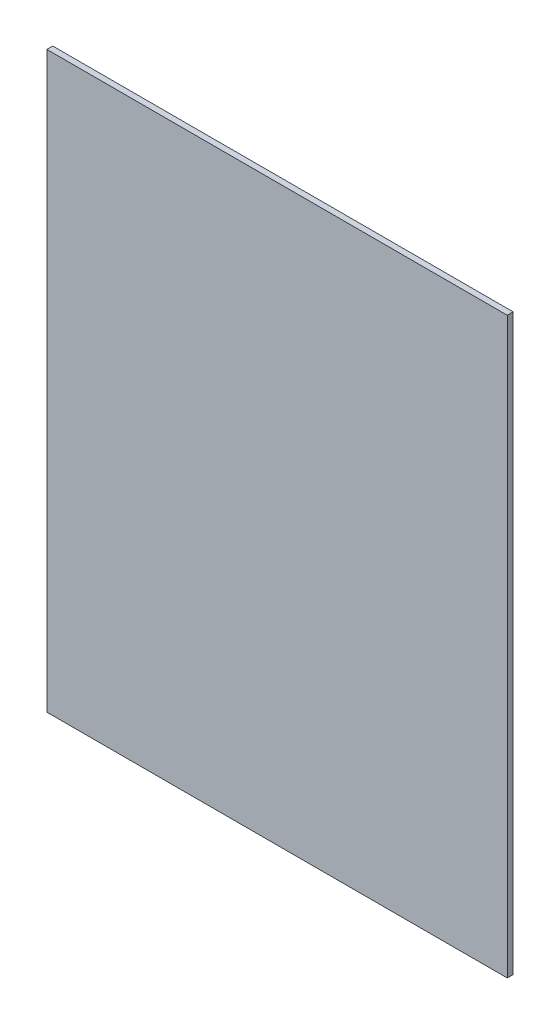
ISO-10303-21;
HEADER;
FILE_DESCRIPTION(('STEP AP214'),'2;1');
FILE_NAME('part.step','',(''),(''),'','','');
FILE_SCHEMA(('AUTOMOTIVE_DESIGN { 1 0 10303 214 1 1 1 1 }'));
ENDSEC;
DATA;
#1=APPLICATION_CONTEXT('core data for automotive mechanical design processes');
#2=APPLICATION_PROTOCOL_DEFINITION('international standard','automotive_design',2000,#1);
#3=PRODUCT_CONTEXT('',#1,'mechanical');
#4=PRODUCT('Part','Part','',(#3));
#5=PRODUCT_RELATED_PRODUCT_CATEGORY('part','',(#4));
#6=PRODUCT_DEFINITION_FORMATION('','',#4);
#7=PRODUCT_DEFINITION_CONTEXT('part definition',#1,'design');
#8=PRODUCT_DEFINITION('design','',#6,#7);
#9=PRODUCT_DEFINITION_SHAPE('','',#8);
#10=(LENGTH_UNIT() NAMED_UNIT(*) SI_UNIT(.MILLI.,.METRE.));
#11=(NAMED_UNIT(*) PLANE_ANGLE_UNIT() SI_UNIT($,.RADIAN.));
#12=(NAMED_UNIT(*) SI_UNIT($,.STERADIAN.) SOLID_ANGLE_UNIT());
#13=UNCERTAINTY_MEASURE_WITH_UNIT(LENGTH_MEASURE(1.E-05),#10,'distance_accuracy_value','');
#14=(GEOMETRIC_REPRESENTATION_CONTEXT(3) GLOBAL_UNCERTAINTY_ASSIGNED_CONTEXT((#13)) GLOBAL_UNIT_ASSIGNED_CONTEXT((#10,
#11,#12)) REPRESENTATION_CONTEXT('',''));
#15=CARTESIAN_POINT('',(0.,0.,0.));
#16=DIRECTION('',(0.,0.,1.));
#17=DIRECTION('',(1.,0.,0.));
#18=AXIS2_PLACEMENT_3D('',#15,#16,#17);
#19=CARTESIAN_POINT('',(117.1575,146.05,2.9972));
#20=DIRECTION('',(-1.,0.,0.));
#21=DIRECTION('',(0.,-1.,0.));
#22=AXIS2_PLACEMENT_3D('',#19,#20,#21);
#23=PLANE('',#22);
#24=DIRECTION('',(0.,1.,0.));
#25=VECTOR('',#24,1.);
#26=CARTESIAN_POINT('',(117.1575,146.05,0.));
#27=LINE('',#26,#25);
#28=CARTESIAN_POINT('',(117.1575,-146.05,0.));
#29=VERTEX_POINT('',#28);
#30=CARTESIAN_POINT('',(117.1575,146.05,0.));
#31=VERTEX_POINT('',#30);
#32=EDGE_CURVE('E107',#29,#31,#27,.T.);
#33=ORIENTED_EDGE('',*,*,#32,.T.);
#34=DIRECTION('',(0.,0.,-1.));
#35=VECTOR('',#34,1.);
#36=CARTESIAN_POINT('',(117.1575,146.05,2.9972));
#37=LINE('',#36,#35);
#38=CARTESIAN_POINT('',(117.1575,146.05,2.9972));
#39=VERTEX_POINT('',#38);
#40=EDGE_CURVE('E11',#39,#31,#37,.T.);
#41=ORIENTED_EDGE('',*,*,#40,.F.);
#42=DIRECTION('',(0.,1.,0.));
#43=VECTOR('',#42,1.);
#44=CARTESIAN_POINT('',(117.1575,146.05,2.9972));
#45=LINE('',#44,#43);
#46=CARTESIAN_POINT('',(117.1575,-146.05,2.9972));
#47=VERTEX_POINT('',#46);
#48=EDGE_CURVE('E91',#47,#39,#45,.T.);
#49=ORIENTED_EDGE('',*,*,#48,.F.);
#50=DIRECTION('',(0.,0.,-1.));
#51=VECTOR('',#50,1.);
#52=CARTESIAN_POINT('',(117.1575,-146.05,2.9972));
#53=LINE('',#52,#51);
#54=EDGE_CURVE('E103',#47,#29,#53,.T.);
#55=ORIENTED_EDGE('',*,*,#54,.T.);
#56=EDGE_LOOP('',(#33,#41,#49,#55));
#57=FACE_BOUND('',#56,.T.);
#58=ADVANCED_FACE('F39',(#57),#23,.F.);
#59=CARTESIAN_POINT('',(-117.1575,146.05,2.9972));
#60=DIRECTION('',(0.,-1.,0.));
#61=DIRECTION('',(0.,0.,-1.));
#62=AXIS2_PLACEMENT_3D('',#59,#60,#61);
#63=PLANE('',#62);
#64=DIRECTION('',(-1.,0.,0.));
#65=VECTOR('',#64,1.);
#66=CARTESIAN_POINT('',(-117.1575,146.05,0.));
#67=LINE('',#66,#65);
#68=CARTESIAN_POINT('',(-117.1575,146.05,0.));
#69=VERTEX_POINT('',#68);
#70=EDGE_CURVE('E96',#31,#69,#67,.T.);
#71=ORIENTED_EDGE('',*,*,#70,.T.);
#72=DIRECTION('',(0.,0.,-1.));
#73=VECTOR('',#72,1.);
#74=CARTESIAN_POINT('',(-117.1575,146.05,2.9972));
#75=LINE('',#74,#73);
#76=CARTESIAN_POINT('',(-117.1575,146.05,2.9972));
#77=VERTEX_POINT('',#76);
#78=EDGE_CURVE('E48',#77,#69,#75,.T.);
#79=ORIENTED_EDGE('',*,*,#78,.F.);
#80=DIRECTION('',(-1.,0.,0.));
#81=VECTOR('',#80,1.);
#82=CARTESIAN_POINT('',(-117.1575,146.05,2.9972));
#83=LINE('',#82,#81);
#84=EDGE_CURVE('E86',#39,#77,#83,.T.);
#85=ORIENTED_EDGE('',*,*,#84,.F.);
#86=ORIENTED_EDGE('',*,*,#40,.T.);
#87=EDGE_LOOP('',(#71,#79,#85,#86));
#88=FACE_BOUND('',#87,.T.);
#89=ADVANCED_FACE('F95',(#88),#63,.F.);
#90=CARTESIAN_POINT('',(-117.1575,146.05,2.9972));
#91=DIRECTION('',(1.,0.,0.));
#92=DIRECTION('',(0.,1.,0.));
#93=AXIS2_PLACEMENT_3D('',#90,#91,#92);
#94=PLANE('',#93);
#95=DIRECTION('',(0.,-1.,0.));
#96=VECTOR('',#95,1.);
#97=CARTESIAN_POINT('',(-117.1575,146.05,0.));
#98=LINE('',#97,#96);
#99=CARTESIAN_POINT('',(-117.1575,-146.05,0.));
#100=VERTEX_POINT('',#99);
#101=EDGE_CURVE('E73',#69,#100,#98,.T.);
#102=ORIENTED_EDGE('',*,*,#101,.T.);
#103=DIRECTION('',(0.,0.,-1.));
#104=VECTOR('',#103,1.);
#105=CARTESIAN_POINT('',(-117.1575,-146.05,2.9972));
#106=LINE('',#105,#104);
#107=CARTESIAN_POINT('',(-117.1575,-146.05,2.9972));
#108=VERTEX_POINT('',#107);
#109=EDGE_CURVE('E98',#108,#100,#106,.T.);
#110=ORIENTED_EDGE('',*,*,#109,.F.);
#111=DIRECTION('',(0.,-1.,0.));
#112=VECTOR('',#111,1.);
#113=CARTESIAN_POINT('',(-117.1575,146.05,2.9972));
#114=LINE('',#113,#112);
#115=EDGE_CURVE('E89',#77,#108,#114,.T.);
#116=ORIENTED_EDGE('',*,*,#115,.F.);
#117=ORIENTED_EDGE('',*,*,#78,.T.);
#118=EDGE_LOOP('',(#102,#110,#116,#117));
#119=FACE_BOUND('',#118,.T.);
#120=ADVANCED_FACE('F99',(#119),#94,.F.);
#121=CARTESIAN_POINT('',(-117.1575,-146.05,2.9972));
#122=DIRECTION('',(0.,1.,0.));
#123=DIRECTION('',(0.,0.,1.));
#124=AXIS2_PLACEMENT_3D('',#121,#122,#123);
#125=PLANE('',#124);
#126=DIRECTION('',(1.,0.,0.));
#127=VECTOR('',#126,1.);
#128=CARTESIAN_POINT('',(-117.1575,-146.05,0.));
#129=LINE('',#128,#127);
#130=EDGE_CURVE('E79',#100,#29,#129,.T.);
#131=ORIENTED_EDGE('',*,*,#130,.T.);
#132=ORIENTED_EDGE('',*,*,#54,.F.);
#133=DIRECTION('',(1.,0.,0.));
#134=VECTOR('',#133,1.);
#135=CARTESIAN_POINT('',(-117.1575,-146.05,2.9972));
#136=LINE('',#135,#134);
#137=EDGE_CURVE('E56',#108,#47,#136,.T.);
#138=ORIENTED_EDGE('',*,*,#137,.F.);
#139=ORIENTED_EDGE('',*,*,#109,.T.);
#140=EDGE_LOOP('',(#131,#132,#138,#139));
#141=FACE_BOUND('',#140,.T.);
#142=ADVANCED_FACE('F120',(#141),#125,.F.);
#143=CARTESIAN_POINT('',(0.,0.,2.9972));
#144=DIRECTION('',(0.,0.,1.));
#145=DIRECTION('',(1.,0.,0.));
#146=AXIS2_PLACEMENT_3D('',#143,#144,#145);
#147=PLANE('',#146);
#148=ORIENTED_EDGE('',*,*,#48,.T.);
#149=ORIENTED_EDGE('',*,*,#84,.T.);
#150=ORIENTED_EDGE('',*,*,#115,.T.);
#151=ORIENTED_EDGE('',*,*,#137,.T.);
#152=EDGE_LOOP('',(#148,#149,#150,#151));
#153=FACE_BOUND('',#152,.T.);
#154=ADVANCED_FACE('F87',(#153),#147,.T.);
#155=CARTESIAN_POINT('',(0.,0.,0.));
#156=DIRECTION('',(0.,0.,1.));
#157=DIRECTION('',(1.,0.,0.));
#158=AXIS2_PLACEMENT_3D('',#155,#156,#157);
#159=PLANE('',#158);
#160=ORIENTED_EDGE('',*,*,#32,.F.);
#161=ORIENTED_EDGE('',*,*,#130,.F.);
#162=ORIENTED_EDGE('',*,*,#101,.F.);
#163=ORIENTED_EDGE('',*,*,#70,.F.);
#164=EDGE_LOOP('',(#160,#161,#162,#163));
#165=FACE_BOUND('',#164,.T.);
#166=ADVANCED_FACE('F123',(#165),#159,.F.);
#167=CLOSED_SHELL('',(#58,#89,#120,#142,#154,#166));
#168=MANIFOLD_SOLID_BREP('B2',#167);
#169=ADVANCED_BREP_SHAPE_REPRESENTATION('',(#18,#168),#14);
#170=SHAPE_DEFINITION_REPRESENTATION(#9,#169);
ENDSEC;
END-ISO-10303-21;
